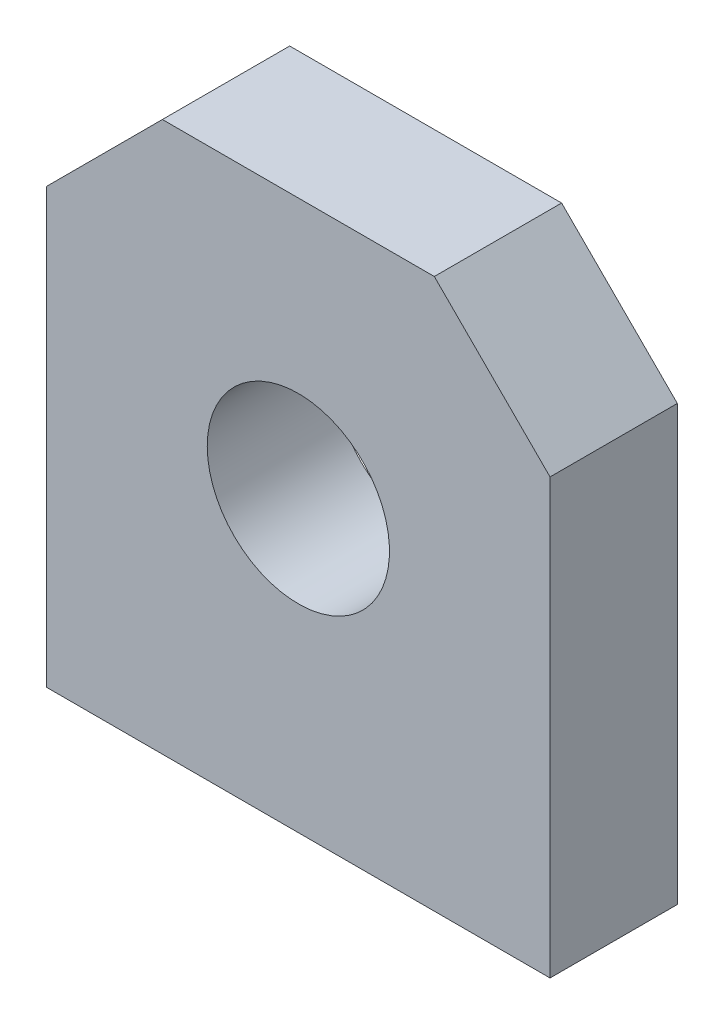
ISO-10303-21;
HEADER;
FILE_DESCRIPTION(('STEP AP214'),'2;1');
FILE_NAME('part.step','',(''),(''),'','','');
FILE_SCHEMA(('AUTOMOTIVE_DESIGN { 1 0 10303 214 1 1 1 1 }'));
ENDSEC;
DATA;
#1=APPLICATION_CONTEXT('core data for automotive mechanical design processes');
#2=APPLICATION_PROTOCOL_DEFINITION('international standard','automotive_design',2000,#1);
#3=PRODUCT_CONTEXT('',#1,'mechanical');
#4=PRODUCT('Part','Part','',(#3));
#5=PRODUCT_RELATED_PRODUCT_CATEGORY('part','',(#4));
#6=PRODUCT_DEFINITION_FORMATION('','',#4);
#7=PRODUCT_DEFINITION_CONTEXT('part definition',#1,'design');
#8=PRODUCT_DEFINITION('design','',#6,#7);
#9=PRODUCT_DEFINITION_SHAPE('','',#8);
#10=(LENGTH_UNIT() NAMED_UNIT(*) SI_UNIT(.MILLI.,.METRE.));
#11=(NAMED_UNIT(*) PLANE_ANGLE_UNIT() SI_UNIT($,.RADIAN.));
#12=(NAMED_UNIT(*) SI_UNIT($,.STERADIAN.) SOLID_ANGLE_UNIT());
#13=UNCERTAINTY_MEASURE_WITH_UNIT(LENGTH_MEASURE(1.E-05),#10,'distance_accuracy_value','');
#14=(GEOMETRIC_REPRESENTATION_CONTEXT(3) GLOBAL_UNCERTAINTY_ASSIGNED_CONTEXT((#13)) GLOBAL_UNIT_ASSIGNED_CONTEXT((#10,
#11,#12)) REPRESENTATION_CONTEXT('',''));
#15=CARTESIAN_POINT('',(0.,0.,0.));
#16=DIRECTION('',(0.,0.,1.));
#17=DIRECTION('',(1.,0.,0.));
#18=AXIS2_PLACEMENT_3D('',#15,#16,#17);
#19=CARTESIAN_POINT('',(-5.52450000000001,-6.03250000000002,2.794));
#20=DIRECTION('',(1.,0.,0.));
#21=DIRECTION('',(0.,0.,-1.));
#22=AXIS2_PLACEMENT_3D('',#19,#20,#21);
#23=PLANE('',#22);
#24=DIRECTION('',(0.,-1.,0.));
#25=VECTOR('',#24,1.);
#26=CARTESIAN_POINT('',(-5.52450000000001,-6.03250000000002,0.));
#27=LINE('',#26,#25);
#28=CARTESIAN_POINT('',(-5.52450000000001,3.49249999999998,0.));
#29=VERTEX_POINT('',#28);
#30=CARTESIAN_POINT('',(-5.52450000000001,-6.03250000000002,0.));
#31=VERTEX_POINT('',#30);
#32=EDGE_CURVE('E119',#29,#31,#27,.T.);
#33=ORIENTED_EDGE('',*,*,#32,.T.);
#34=DIRECTION('',(0.,0.,-1.));
#35=VECTOR('',#34,1.);
#36=CARTESIAN_POINT('',(-5.52450000000001,-6.03250000000002,2.794));
#37=LINE('',#36,#35);
#38=CARTESIAN_POINT('',(-5.52450000000001,-6.03250000000002,2.794));
#39=VERTEX_POINT('',#38);
#40=EDGE_CURVE('E11',#39,#31,#37,.T.);
#41=ORIENTED_EDGE('',*,*,#40,.F.);
#42=DIRECTION('',(0.,-1.,0.));
#43=VECTOR('',#42,1.);
#44=CARTESIAN_POINT('',(-5.52450000000001,-6.03250000000002,2.794));
#45=LINE('',#44,#43);
#46=CARTESIAN_POINT('',(-5.52450000000001,3.49249999999998,2.794));
#47=VERTEX_POINT('',#46);
#48=EDGE_CURVE('E130',#47,#39,#45,.T.);
#49=ORIENTED_EDGE('',*,*,#48,.F.);
#50=DIRECTION('',(0.,0.,-1.));
#51=VECTOR('',#50,1.);
#52=CARTESIAN_POINT('',(-5.52450000000001,3.49249999999998,2.794));
#53=LINE('',#52,#51);
#54=EDGE_CURVE('E115',#47,#29,#53,.T.);
#55=ORIENTED_EDGE('',*,*,#54,.T.);
#56=EDGE_LOOP('',(#33,#41,#49,#55));
#57=FACE_BOUND('',#56,.T.);
#58=ADVANCED_FACE('F35',(#57),#23,.F.);
#59=CARTESIAN_POINT('',(-5.52450000000001,-6.03250000000002,2.794));
#60=DIRECTION('',(0.,1.,0.));
#61=DIRECTION('',(0.,0.,1.));
#62=AXIS2_PLACEMENT_3D('',#59,#60,#61);
#63=PLANE('',#62);
#64=DIRECTION('',(1.,0.,0.));
#65=VECTOR('',#64,1.);
#66=CARTESIAN_POINT('',(-5.52450000000001,-6.03250000000002,0.));
#67=LINE('',#66,#65);
#68=CARTESIAN_POINT('',(5.52449999999999,-6.03250000000002,0.));
#69=VERTEX_POINT('',#68);
#70=EDGE_CURVE('E122',#31,#69,#67,.T.);
#71=ORIENTED_EDGE('',*,*,#70,.T.);
#72=DIRECTION('',(0.,0.,-1.));
#73=VECTOR('',#72,1.);
#74=CARTESIAN_POINT('',(5.52449999999999,-6.03250000000002,2.794));
#75=LINE('',#74,#73);
#76=CARTESIAN_POINT('',(5.52449999999999,-6.03250000000002,2.794));
#77=VERTEX_POINT('',#76);
#78=EDGE_CURVE('E43',#77,#69,#75,.T.);
#79=ORIENTED_EDGE('',*,*,#78,.F.);
#80=DIRECTION('',(1.,0.,0.));
#81=VECTOR('',#80,1.);
#82=CARTESIAN_POINT('',(-5.52450000000001,-6.03250000000002,2.794));
#83=LINE('',#82,#81);
#84=EDGE_CURVE('E88',#39,#77,#83,.T.);
#85=ORIENTED_EDGE('',*,*,#84,.F.);
#86=ORIENTED_EDGE('',*,*,#40,.T.);
#87=EDGE_LOOP('',(#71,#79,#85,#86));
#88=FACE_BOUND('',#87,.T.);
#89=ADVANCED_FACE('F155',(#88),#63,.F.);
#90=CARTESIAN_POINT('',(5.52449999999999,-6.03250000000002,2.794));
#91=DIRECTION('',(-1.,0.,0.));
#92=DIRECTION('',(0.,0.,1.));
#93=AXIS2_PLACEMENT_3D('',#90,#91,#92);
#94=PLANE('',#93);
#95=DIRECTION('',(0.,1.,0.));
#96=VECTOR('',#95,1.);
#97=CARTESIAN_POINT('',(5.52449999999999,-6.03250000000002,0.));
#98=LINE('',#97,#96);
#99=CARTESIAN_POINT('',(5.52449999999999,3.49249999999998,0.));
#100=VERTEX_POINT('',#99);
#101=EDGE_CURVE('E125',#69,#100,#98,.T.);
#102=ORIENTED_EDGE('',*,*,#101,.T.);
#103=DIRECTION('',(0.,0.,-1.));
#104=VECTOR('',#103,1.);
#105=CARTESIAN_POINT('',(5.52449999999999,3.49249999999998,2.794));
#106=LINE('',#105,#104);
#107=CARTESIAN_POINT('',(5.52449999999999,3.49249999999998,2.794));
#108=VERTEX_POINT('',#107);
#109=EDGE_CURVE('E110',#108,#100,#106,.T.);
#110=ORIENTED_EDGE('',*,*,#109,.F.);
#111=DIRECTION('',(0.,1.,0.));
#112=VECTOR('',#111,1.);
#113=CARTESIAN_POINT('',(5.52449999999999,-6.03250000000002,2.794));
#114=LINE('',#113,#112);
#115=EDGE_CURVE('E101',#77,#108,#114,.T.);
#116=ORIENTED_EDGE('',*,*,#115,.F.);
#117=ORIENTED_EDGE('',*,*,#78,.T.);
#118=EDGE_LOOP('',(#102,#110,#116,#117));
#119=FACE_BOUND('',#118,.T.);
#120=ADVANCED_FACE('F136',(#119),#94,.F.);
#121=CARTESIAN_POINT('',(5.52449999999999,3.49249999999998,2.794));
#122=DIRECTION('',(-0.707106781186548,-0.707106781186548,0.));
#123=DIRECTION('',(0.707106781186548,-0.707106781186548,0.));
#124=AXIS2_PLACEMENT_3D('',#121,#122,#123);
#125=PLANE('',#124);
#126=DIRECTION('',(-0.707106781186548,0.707106781186548,0.));
#127=VECTOR('',#126,1.);
#128=CARTESIAN_POINT('',(5.52449999999999,3.49249999999998,0.));
#129=LINE('',#128,#127);
#130=CARTESIAN_POINT('',(2.98449999999999,6.03249999999998,0.));
#131=VERTEX_POINT('',#130);
#132=EDGE_CURVE('E109',#100,#131,#129,.T.);
#133=ORIENTED_EDGE('',*,*,#132,.T.);
#134=DIRECTION('',(0.,0.,-1.));
#135=VECTOR('',#134,1.);
#136=CARTESIAN_POINT('',(2.98449999999999,6.03249999999998,2.794));
#137=LINE('',#136,#135);
#138=CARTESIAN_POINT('',(2.98449999999999,6.03249999999998,2.794));
#139=VERTEX_POINT('',#138);
#140=EDGE_CURVE('E106',#139,#131,#137,.T.);
#141=ORIENTED_EDGE('',*,*,#140,.F.);
#142=DIRECTION('',(-0.707106781186548,0.707106781186548,0.));
#143=VECTOR('',#142,1.);
#144=CARTESIAN_POINT('',(5.52449999999999,3.49249999999998,2.794));
#145=LINE('',#144,#143);
#146=EDGE_CURVE('E95',#108,#139,#145,.T.);
#147=ORIENTED_EDGE('',*,*,#146,.F.);
#148=ORIENTED_EDGE('',*,*,#109,.T.);
#149=EDGE_LOOP('',(#133,#141,#147,#148));
#150=FACE_BOUND('',#149,.T.);
#151=ADVANCED_FACE('F107',(#150),#125,.F.);
#152=CARTESIAN_POINT('',(-2.98450000000001,6.03249999999998,2.794));
#153=DIRECTION('',(0.,-1.,0.));
#154=DIRECTION('',(0.,0.,-1.));
#155=AXIS2_PLACEMENT_3D('',#152,#153,#154);
#156=PLANE('',#155);
#157=DIRECTION('',(-1.,0.,0.));
#158=VECTOR('',#157,1.);
#159=CARTESIAN_POINT('',(-2.98450000000001,6.03249999999998,0.));
#160=LINE('',#159,#158);
#161=CARTESIAN_POINT('',(-2.98450000000001,6.03249999999998,0.));
#162=VERTEX_POINT('',#161);
#163=EDGE_CURVE('E74',#131,#162,#160,.T.);
#164=ORIENTED_EDGE('',*,*,#163,.T.);
#165=DIRECTION('',(0.,0.,-1.));
#166=VECTOR('',#165,1.);
#167=CARTESIAN_POINT('',(-2.98450000000001,6.03249999999998,2.794));
#168=LINE('',#167,#166);
#169=CARTESIAN_POINT('',(-2.98450000000001,6.03249999999998,2.794));
#170=VERTEX_POINT('',#169);
#171=EDGE_CURVE('E111',#170,#162,#168,.T.);
#172=ORIENTED_EDGE('',*,*,#171,.F.);
#173=DIRECTION('',(-1.,0.,0.));
#174=VECTOR('',#173,1.);
#175=CARTESIAN_POINT('',(-2.98450000000001,6.03249999999998,2.794));
#176=LINE('',#175,#174);
#177=EDGE_CURVE('E99',#139,#170,#176,.T.);
#178=ORIENTED_EDGE('',*,*,#177,.F.);
#179=ORIENTED_EDGE('',*,*,#140,.T.);
#180=EDGE_LOOP('',(#164,#172,#178,#179));
#181=FACE_BOUND('',#180,.T.);
#182=ADVANCED_FACE('F113',(#181),#156,.F.);
#183=CARTESIAN_POINT('',(-5.52450000000001,3.49249999999998,2.794));
#184=DIRECTION('',(0.707106781186548,-0.707106781186548,0.));
#185=DIRECTION('',(0.707106781186548,0.707106781186548,0.));
#186=AXIS2_PLACEMENT_3D('',#183,#184,#185);
#187=PLANE('',#186);
#188=DIRECTION('',(-0.707106781186548,-0.707106781186548,0.));
#189=VECTOR('',#188,1.);
#190=CARTESIAN_POINT('',(-5.52450000000001,3.49249999999998,0.));
#191=LINE('',#190,#189);
#192=EDGE_CURVE('E80',#162,#29,#191,.T.);
#193=ORIENTED_EDGE('',*,*,#192,.T.);
#194=ORIENTED_EDGE('',*,*,#54,.F.);
#195=DIRECTION('',(-0.707106781186548,-0.707106781186548,0.));
#196=VECTOR('',#195,1.);
#197=CARTESIAN_POINT('',(-5.52450000000001,3.49249999999998,2.794));
#198=LINE('',#197,#196);
#199=EDGE_CURVE('E51',#170,#47,#198,.T.);
#200=ORIENTED_EDGE('',*,*,#199,.F.);
#201=ORIENTED_EDGE('',*,*,#171,.T.);
#202=EDGE_LOOP('',(#193,#194,#200,#201));
#203=FACE_BOUND('',#202,.T.);
#204=ADVANCED_FACE('F143',(#203),#187,.F.);
#205=CARTESIAN_POINT('',(0.,0.,2.794));
#206=DIRECTION('',(0.,0.,-1.));
#207=DIRECTION('',(-1.,0.,0.));
#208=AXIS2_PLACEMENT_3D('',#205,#206,#207);
#209=PLANE('',#208);
#210=CARTESIAN_POINT('',(0.,0.317499999999983,2.794));
#211=DIRECTION('',(0.,0.,-1.));
#212=DIRECTION('',(-1.,0.,0.));
#213=AXIS2_PLACEMENT_3D('',#210,#211,#212);
#214=CIRCLE('',#213,2.);
#215=CARTESIAN_POINT('',(-2.,0.317499999999983,2.794));
#216=VERTEX_POINT('',#215);
#217=EDGE_CURVE('E123',#216,#216,#214,.T.);
#218=ORIENTED_EDGE('',*,*,#217,.T.);
#219=EDGE_LOOP('',(#218));
#220=FACE_BOUND('',#219,.T.);
#221=ORIENTED_EDGE('',*,*,#48,.T.);
#222=ORIENTED_EDGE('',*,*,#84,.T.);
#223=ORIENTED_EDGE('',*,*,#115,.T.);
#224=ORIENTED_EDGE('',*,*,#146,.T.);
#225=ORIENTED_EDGE('',*,*,#177,.T.);
#226=ORIENTED_EDGE('',*,*,#199,.T.);
#227=EDGE_LOOP('',(#221,#222,#223,#224,#225,#226));
#228=FACE_BOUND('',#227,.T.);
#229=ADVANCED_FACE('F97',(#220,#228),#209,.F.);
#230=CARTESIAN_POINT('',(0.,0.,0.));
#231=DIRECTION('',(0.,0.,-1.));
#232=DIRECTION('',(-1.,0.,0.));
#233=AXIS2_PLACEMENT_3D('',#230,#231,#232);
#234=PLANE('',#233);
#235=CARTESIAN_POINT('',(0.,0.317499999999983,0.));
#236=DIRECTION('',(0.,0.,-1.));
#237=DIRECTION('',(-1.,0.,0.));
#238=AXIS2_PLACEMENT_3D('',#235,#236,#237);
#239=CIRCLE('',#238,2.);
#240=CARTESIAN_POINT('',(-2.,0.317499999999983,0.));
#241=VERTEX_POINT('',#240);
#242=EDGE_CURVE('E210',#241,#241,#239,.T.);
#243=ORIENTED_EDGE('',*,*,#242,.F.);
#244=EDGE_LOOP('',(#243));
#245=FACE_BOUND('',#244,.T.);
#246=ORIENTED_EDGE('',*,*,#32,.F.);
#247=ORIENTED_EDGE('',*,*,#192,.F.);
#248=ORIENTED_EDGE('',*,*,#163,.F.);
#249=ORIENTED_EDGE('',*,*,#132,.F.);
#250=ORIENTED_EDGE('',*,*,#101,.F.);
#251=ORIENTED_EDGE('',*,*,#70,.F.);
#252=EDGE_LOOP('',(#246,#247,#248,#249,#250,#251));
#253=FACE_BOUND('',#252,.T.);
#254=ADVANCED_FACE('F139',(#245,#253),#234,.T.);
#255=CARTESIAN_POINT('',(0.,0.317499999999983,2.794));
#256=DIRECTION('',(0.,0.,-1.));
#257=DIRECTION('',(-1.,0.,0.));
#258=AXIS2_PLACEMENT_3D('',#255,#256,#257);
#259=CYLINDRICAL_SURFACE('',#258,2.);
#260=ORIENTED_EDGE('',*,*,#217,.F.);
#261=EDGE_LOOP('',(#260));
#262=FACE_BOUND('',#261,.T.);
#263=ORIENTED_EDGE('',*,*,#242,.T.);
#264=EDGE_LOOP('',(#263));
#265=FACE_BOUND('',#264,.T.);
#266=ADVANCED_FACE('F192',(#262,#265),#259,.F.);
#267=CLOSED_SHELL('',(#58,#89,#120,#151,#182,#204,#229,#254,#266));
#268=MANIFOLD_SOLID_BREP('B2',#267);
#269=ADVANCED_BREP_SHAPE_REPRESENTATION('',(#18,#268),#14);
#270=SHAPE_DEFINITION_REPRESENTATION(#9,#269);
ENDSEC;
END-ISO-10303-21;
